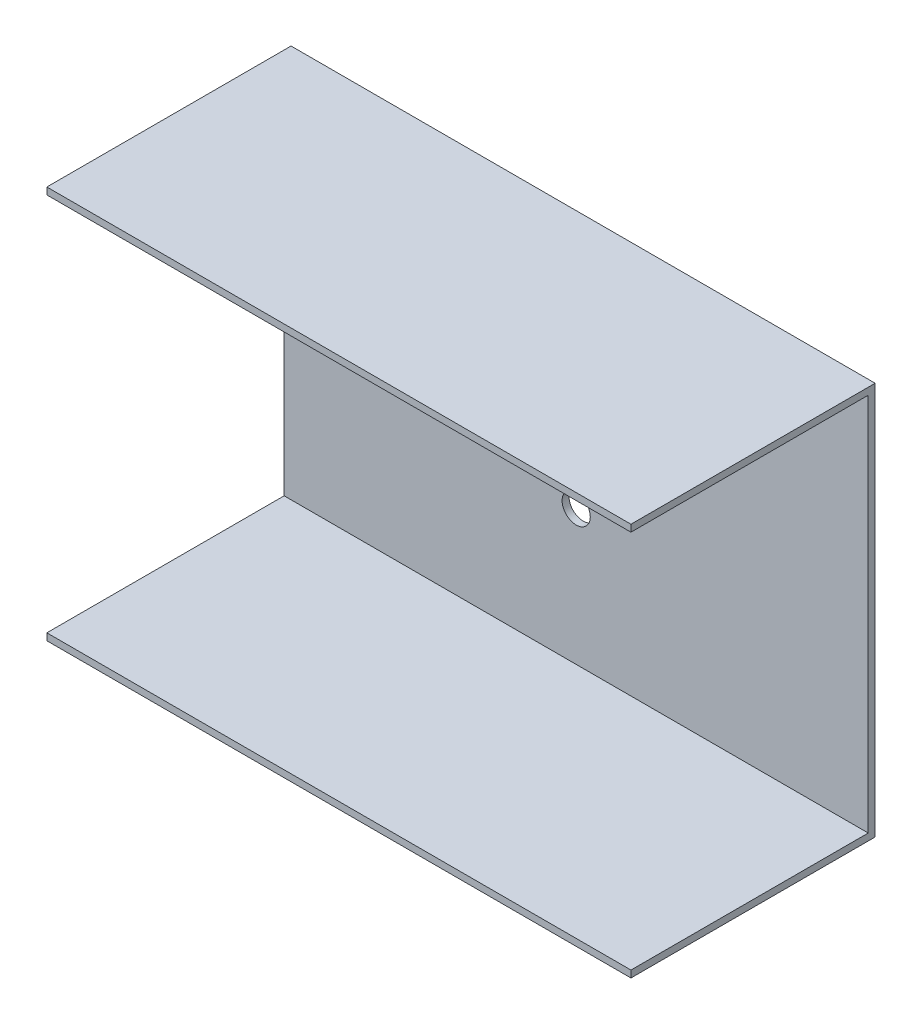
ISO-10303-21;
HEADER;
FILE_DESCRIPTION(('STEP AP214'),'2;1');
FILE_NAME('part.step','',(''),(''),'','','');
FILE_SCHEMA(('AUTOMOTIVE_DESIGN { 1 0 10303 214 1 1 1 1 }'));
ENDSEC;
DATA;
#1=APPLICATION_CONTEXT('core data for automotive mechanical design processes');
#2=APPLICATION_PROTOCOL_DEFINITION('international standard','automotive_design',2000,#1);
#3=PRODUCT_CONTEXT('',#1,'mechanical');
#4=PRODUCT('Part','Part','',(#3));
#5=PRODUCT_RELATED_PRODUCT_CATEGORY('part','',(#4));
#6=PRODUCT_DEFINITION_FORMATION('','',#4);
#7=PRODUCT_DEFINITION_CONTEXT('part definition',#1,'design');
#8=PRODUCT_DEFINITION('design','',#6,#7);
#9=PRODUCT_DEFINITION_SHAPE('','',#8);
#10=(LENGTH_UNIT() NAMED_UNIT(*) SI_UNIT(.MILLI.,.METRE.));
#11=(NAMED_UNIT(*) PLANE_ANGLE_UNIT() SI_UNIT($,.RADIAN.));
#12=(NAMED_UNIT(*) SI_UNIT($,.STERADIAN.) SOLID_ANGLE_UNIT());
#13=UNCERTAINTY_MEASURE_WITH_UNIT(LENGTH_MEASURE(1.E-05),#10,'distance_accuracy_value','');
#14=(GEOMETRIC_REPRESENTATION_CONTEXT(3) GLOBAL_UNCERTAINTY_ASSIGNED_CONTEXT((#13)) GLOBAL_UNIT_ASSIGNED_CONTEXT((#10,
#11,#12)) REPRESENTATION_CONTEXT('',''));
#15=CARTESIAN_POINT('',(0.,0.,0.));
#16=DIRECTION('',(0.,0.,1.));
#17=DIRECTION('',(1.,0.,0.));
#18=AXIS2_PLACEMENT_3D('',#15,#16,#17);
#19=CARTESIAN_POINT('',(135.3879,0.,-56.6002));
#20=DIRECTION('',(0.,-1.,0.));
#21=DIRECTION('',(0.,0.,-1.));
#22=AXIS2_PLACEMENT_3D('',#19,#20,#21);
#23=PLANE('',#22);
#24=DIRECTION('',(0.,0.,1.));
#25=VECTOR('',#24,1.);
#26=CARTESIAN_POINT('',(0.,0.,-56.6002));
#27=LINE('',#26,#25);
#28=CARTESIAN_POINT('',(0.,0.,-56.6002));
#29=VERTEX_POINT('',#28);
#30=CARTESIAN_POINT('',(0.,0.,0.));
#31=VERTEX_POINT('',#30);
#32=EDGE_CURVE('E144',#29,#31,#27,.T.);
#33=ORIENTED_EDGE('',*,*,#32,.T.);
#34=DIRECTION('',(-1.,0.,0.));
#35=VECTOR('',#34,1.);
#36=CARTESIAN_POINT('',(135.3879,0.,0.));
#37=LINE('',#36,#35);
#38=CARTESIAN_POINT('',(135.3879,0.,0.));
#39=VERTEX_POINT('',#38);
#40=EDGE_CURVE('E11',#39,#31,#37,.T.);
#41=ORIENTED_EDGE('',*,*,#40,.F.);
#42=DIRECTION('',(0.,0.,1.));
#43=VECTOR('',#42,1.);
#44=CARTESIAN_POINT('',(135.3879,0.,-56.6002));
#45=LINE('',#44,#43);
#46=CARTESIAN_POINT('',(135.3879,0.,-56.6002));
#47=VERTEX_POINT('',#46);
#48=EDGE_CURVE('E167',#47,#39,#45,.T.);
#49=ORIENTED_EDGE('',*,*,#48,.F.);
#50=DIRECTION('',(-1.,0.,0.));
#51=VECTOR('',#50,1.);
#52=CARTESIAN_POINT('',(135.3879,0.,-56.6002));
#53=LINE('',#52,#51);
#54=EDGE_CURVE('E140',#47,#29,#53,.T.);
#55=ORIENTED_EDGE('',*,*,#54,.T.);
#56=EDGE_LOOP('',(#33,#41,#49,#55));
#57=FACE_BOUND('',#56,.T.);
#58=ADVANCED_FACE('F43',(#57),#23,.F.);
#59=CARTESIAN_POINT('',(135.3879,0.,0.));
#60=DIRECTION('',(0.,0.,-1.));
#61=DIRECTION('',(0.,1.,0.));
#62=AXIS2_PLACEMENT_3D('',#59,#60,#61);
#63=PLANE('',#62);
#64=DIRECTION('',(0.,-1.,0.));
#65=VECTOR('',#64,1.);
#66=CARTESIAN_POINT('',(0.,0.,0.));
#67=LINE('',#66,#65);
#68=CARTESIAN_POINT('',(0.,-1.6002,0.));
#69=VERTEX_POINT('',#68);
#70=EDGE_CURVE('E148',#31,#69,#67,.T.);
#71=ORIENTED_EDGE('',*,*,#70,.T.);
#72=DIRECTION('',(-1.,0.,0.));
#73=VECTOR('',#72,1.);
#74=CARTESIAN_POINT('',(135.3879,-1.6002,0.));
#75=LINE('',#74,#73);
#76=CARTESIAN_POINT('',(135.3879,-1.6002,0.));
#77=VERTEX_POINT('',#76);
#78=EDGE_CURVE('E52',#77,#69,#75,.T.);
#79=ORIENTED_EDGE('',*,*,#78,.F.);
#80=DIRECTION('',(0.,-1.,0.));
#81=VECTOR('',#80,1.);
#82=CARTESIAN_POINT('',(135.3879,0.,0.));
#83=LINE('',#82,#81);
#84=EDGE_CURVE('E103',#39,#77,#83,.T.);
#85=ORIENTED_EDGE('',*,*,#84,.F.);
#86=ORIENTED_EDGE('',*,*,#40,.T.);
#87=EDGE_LOOP('',(#71,#79,#85,#86));
#88=FACE_BOUND('',#87,.T.);
#89=ADVANCED_FACE('F269',(#88),#63,.F.);
#90=CARTESIAN_POINT('',(135.3879,-1.6002,0.));
#91=DIRECTION('',(0.,1.,0.));
#92=DIRECTION('',(0.,0.,1.));
#93=AXIS2_PLACEMENT_3D('',#90,#91,#92);
#94=PLANE('',#93);
#95=DIRECTION('',(0.,0.,-1.));
#96=VECTOR('',#95,1.);
#97=CARTESIAN_POINT('',(0.,-1.6002,0.));
#98=LINE('',#97,#96);
#99=CARTESIAN_POINT('',(0.,-1.6002,-55.));
#100=VERTEX_POINT('',#99);
#101=EDGE_CURVE('E152',#69,#100,#98,.T.);
#102=ORIENTED_EDGE('',*,*,#101,.T.);
#103=DIRECTION('',(-1.,0.,0.));
#104=VECTOR('',#103,1.);
#105=CARTESIAN_POINT('',(135.3879,-1.6002,-55.));
#106=LINE('',#105,#104);
#107=CARTESIAN_POINT('',(135.3879,-1.6002,-55.));
#108=VERTEX_POINT('',#107);
#109=EDGE_CURVE('E178',#108,#100,#106,.T.);
#110=ORIENTED_EDGE('',*,*,#109,.F.);
#111=DIRECTION('',(0.,0.,-1.));
#112=VECTOR('',#111,1.);
#113=CARTESIAN_POINT('',(135.3879,-1.6002,0.));
#114=LINE('',#113,#112);
#115=EDGE_CURVE('E188',#77,#108,#114,.T.);
#116=ORIENTED_EDGE('',*,*,#115,.F.);
#117=ORIENTED_EDGE('',*,*,#78,.T.);
#118=EDGE_LOOP('',(#102,#110,#116,#117));
#119=FACE_BOUND('',#118,.T.);
#120=ADVANCED_FACE('F186',(#119),#94,.F.);
#121=CARTESIAN_POINT('',(135.3879,-1.6002,-55.));
#122=DIRECTION('',(0.,0.,-1.));
#123=DIRECTION('',(0.,1.,0.));
#124=AXIS2_PLACEMENT_3D('',#121,#122,#123);
#125=PLANE('',#124);
#126=CARTESIAN_POINT('',(67.69395,-32.84554,-55.));
#127=DIRECTION('',(0.,0.,1.));
#128=DIRECTION('',(1.,0.,0.));
#129=AXIS2_PLACEMENT_3D('',#126,#127,#128);
#130=CIRCLE('',#129,3.2639);
#131=CARTESIAN_POINT('',(70.95785,-32.84554,-55.));
#132=VERTEX_POINT('',#131);
#133=EDGE_CURVE('E232',#132,#132,#130,.T.);
#134=ORIENTED_EDGE('',*,*,#133,.F.);
#135=EDGE_LOOP('',(#134));
#136=FACE_BOUND('',#135,.T.);
#137=CARTESIAN_POINT('',(67.69395,-58.24554,-55.));
#138=DIRECTION('',(0.,0.,1.));
#139=DIRECTION('',(1.,0.,0.));
#140=AXIS2_PLACEMENT_3D('',#137,#138,#139);
#141=CIRCLE('',#140,3.2639);
#142=CARTESIAN_POINT('',(70.95785,-58.24554,-55.));
#143=VERTEX_POINT('',#142);
#144=EDGE_CURVE('E228',#143,#143,#141,.T.);
#145=ORIENTED_EDGE('',*,*,#144,.F.);
#146=EDGE_LOOP('',(#145));
#147=FACE_BOUND('',#146,.T.);
#148=CARTESIAN_POINT('',(54.99395,-45.54554,-55.));
#149=DIRECTION('',(0.,0.,1.));
#150=DIRECTION('',(1.,0.,0.));
#151=AXIS2_PLACEMENT_3D('',#148,#149,#150);
#152=CIRCLE('',#151,3.26390000000001);
#153=CARTESIAN_POINT('',(58.25785,-45.54554,-55.));
#154=VERTEX_POINT('',#153);
#155=EDGE_CURVE('E220',#154,#154,#152,.T.);
#156=ORIENTED_EDGE('',*,*,#155,.F.);
#157=EDGE_LOOP('',(#156));
#158=FACE_BOUND('',#157,.T.);
#159=CARTESIAN_POINT('',(80.39395,-45.54554,-55.));
#160=DIRECTION('',(0.,0.,1.));
#161=DIRECTION('',(1.,0.,0.));
#162=AXIS2_PLACEMENT_3D('',#159,#160,#161);
#163=CIRCLE('',#162,3.2639);
#164=CARTESIAN_POINT('',(83.65785,-45.54554,-55.));
#165=VERTEX_POINT('',#164);
#166=EDGE_CURVE('E211',#165,#165,#163,.T.);
#167=ORIENTED_EDGE('',*,*,#166,.F.);
#168=EDGE_LOOP('',(#167));
#169=FACE_BOUND('',#168,.T.);
#170=DIRECTION('',(0.,-1.,0.));
#171=VECTOR('',#170,1.);
#172=CARTESIAN_POINT('',(0.,-1.6002,-55.));
#173=LINE('',#172,#171);
#174=CARTESIAN_POINT('',(0.,-89.49088,-55.));
#175=VERTEX_POINT('',#174);
#176=EDGE_CURVE('E155',#100,#175,#173,.T.);
#177=ORIENTED_EDGE('',*,*,#176,.T.);
#178=DIRECTION('',(-1.,0.,0.));
#179=VECTOR('',#178,1.);
#180=CARTESIAN_POINT('',(135.3879,-89.49088,-55.));
#181=LINE('',#180,#179);
#182=CARTESIAN_POINT('',(135.3879,-89.49088,-55.));
#183=VERTEX_POINT('',#182);
#184=EDGE_CURVE('E174',#183,#175,#181,.T.);
#185=ORIENTED_EDGE('',*,*,#184,.F.);
#186=DIRECTION('',(0.,-1.,0.));
#187=VECTOR('',#186,1.);
#188=CARTESIAN_POINT('',(135.3879,-1.6002,-55.));
#189=LINE('',#188,#187);
#190=EDGE_CURVE('E201',#108,#183,#189,.T.);
#191=ORIENTED_EDGE('',*,*,#190,.F.);
#192=ORIENTED_EDGE('',*,*,#109,.T.);
#193=EDGE_LOOP('',(#177,#185,#191,#192));
#194=FACE_BOUND('',#193,.T.);
#195=ADVANCED_FACE('F196',(#136,#147,#158,#169,#194),#125,.F.);
#196=CARTESIAN_POINT('',(135.3879,-89.49088,-55.));
#197=DIRECTION('',(0.,-1.,0.));
#198=DIRECTION('',(0.,0.,-1.));
#199=AXIS2_PLACEMENT_3D('',#196,#197,#198);
#200=PLANE('',#199);
#201=DIRECTION('',(0.,0.,1.));
#202=VECTOR('',#201,1.);
#203=CARTESIAN_POINT('',(0.,-89.49088,-55.));
#204=LINE('',#203,#202);
#205=CARTESIAN_POINT('',(0.,-89.49088,0.));
#206=VERTEX_POINT('',#205);
#207=EDGE_CURVE('E158',#175,#206,#204,.T.);
#208=ORIENTED_EDGE('',*,*,#207,.T.);
#209=DIRECTION('',(-1.,0.,0.));
#210=VECTOR('',#209,1.);
#211=CARTESIAN_POINT('',(135.3879,-89.49088,0.));
#212=LINE('',#211,#210);
#213=CARTESIAN_POINT('',(135.3879,-89.49088,0.));
#214=VERTEX_POINT('',#213);
#215=EDGE_CURVE('E133',#214,#206,#212,.T.);
#216=ORIENTED_EDGE('',*,*,#215,.F.);
#217=DIRECTION('',(0.,0.,1.));
#218=VECTOR('',#217,1.);
#219=CARTESIAN_POINT('',(135.3879,-89.49088,-55.));
#220=LINE('',#219,#218);
#221=EDGE_CURVE('E122',#183,#214,#220,.T.);
#222=ORIENTED_EDGE('',*,*,#221,.F.);
#223=ORIENTED_EDGE('',*,*,#184,.T.);
#224=EDGE_LOOP('',(#208,#216,#222,#223));
#225=FACE_BOUND('',#224,.T.);
#226=ADVANCED_FACE('F199',(#225),#200,.F.);
#227=CARTESIAN_POINT('',(135.3879,-89.49088,0.));
#228=DIRECTION('',(0.,0.,-1.));
#229=DIRECTION('',(0.,1.,0.));
#230=AXIS2_PLACEMENT_3D('',#227,#228,#229);
#231=PLANE('',#230);
#232=DIRECTION('',(0.,-1.,0.));
#233=VECTOR('',#232,1.);
#234=CARTESIAN_POINT('',(0.,-89.49088,0.));
#235=LINE('',#234,#233);
#236=CARTESIAN_POINT('',(0.,-91.09108,0.));
#237=VERTEX_POINT('',#236);
#238=EDGE_CURVE('E131',#206,#237,#235,.T.);
#239=ORIENTED_EDGE('',*,*,#238,.T.);
#240=DIRECTION('',(-1.,0.,0.));
#241=VECTOR('',#240,1.);
#242=CARTESIAN_POINT('',(135.3879,-91.09108,0.));
#243=LINE('',#242,#241);
#244=CARTESIAN_POINT('',(135.3879,-91.09108,0.));
#245=VERTEX_POINT('',#244);
#246=EDGE_CURVE('E128',#245,#237,#243,.T.);
#247=ORIENTED_EDGE('',*,*,#246,.F.);
#248=DIRECTION('',(0.,-1.,0.));
#249=VECTOR('',#248,1.);
#250=CARTESIAN_POINT('',(135.3879,-89.49088,0.));
#251=LINE('',#250,#249);
#252=EDGE_CURVE('E116',#214,#245,#251,.T.);
#253=ORIENTED_EDGE('',*,*,#252,.F.);
#254=ORIENTED_EDGE('',*,*,#215,.T.);
#255=EDGE_LOOP('',(#239,#247,#253,#254));
#256=FACE_BOUND('',#255,.T.);
#257=ADVANCED_FACE('F129',(#256),#231,.F.);
#258=CARTESIAN_POINT('',(135.3879,-91.09108,0.));
#259=DIRECTION('',(0.,1.,0.));
#260=DIRECTION('',(0.,0.,1.));
#261=AXIS2_PLACEMENT_3D('',#258,#259,#260);
#262=PLANE('',#261);
#263=DIRECTION('',(0.,0.,-1.));
#264=VECTOR('',#263,1.);
#265=CARTESIAN_POINT('',(0.,-91.09108,0.));
#266=LINE('',#265,#264);
#267=CARTESIAN_POINT('',(0.,-91.09108,-56.6002));
#268=VERTEX_POINT('',#267);
#269=EDGE_CURVE('E89',#237,#268,#266,.T.);
#270=ORIENTED_EDGE('',*,*,#269,.T.);
#271=DIRECTION('',(-1.,0.,0.));
#272=VECTOR('',#271,1.);
#273=CARTESIAN_POINT('',(135.3879,-91.09108,-56.6002));
#274=LINE('',#273,#272);
#275=CARTESIAN_POINT('',(135.3879,-91.09108,-56.6002));
#276=VERTEX_POINT('',#275);
#277=EDGE_CURVE('E134',#276,#268,#274,.T.);
#278=ORIENTED_EDGE('',*,*,#277,.F.);
#279=DIRECTION('',(0.,0.,-1.));
#280=VECTOR('',#279,1.);
#281=CARTESIAN_POINT('',(135.3879,-91.09108,0.));
#282=LINE('',#281,#280);
#283=EDGE_CURVE('E120',#245,#276,#282,.T.);
#284=ORIENTED_EDGE('',*,*,#283,.F.);
#285=ORIENTED_EDGE('',*,*,#246,.T.);
#286=EDGE_LOOP('',(#270,#278,#284,#285));
#287=FACE_BOUND('',#286,.T.);
#288=ADVANCED_FACE('F136',(#287),#262,.F.);
#289=CARTESIAN_POINT('',(135.3879,-91.09108,-56.6002));
#290=DIRECTION('',(0.,0.,1.));
#291=DIRECTION('',(1.,0.,0.));
#292=AXIS2_PLACEMENT_3D('',#289,#290,#291);
#293=PLANE('',#292);
#294=CARTESIAN_POINT('',(67.69395,-32.84554,-56.6002));
#295=DIRECTION('',(0.,0.,1.));
#296=DIRECTION('',(1.,0.,0.));
#297=AXIS2_PLACEMENT_3D('',#294,#295,#296);
#298=CIRCLE('',#297,3.2639);
#299=CARTESIAN_POINT('',(70.95785,-32.84554,-56.6002));
#300=VERTEX_POINT('',#299);
#301=EDGE_CURVE('E149',#300,#300,#298,.F.);
#302=ORIENTED_EDGE('',*,*,#301,.F.);
#303=EDGE_LOOP('',(#302));
#304=FACE_BOUND('',#303,.T.);
#305=CARTESIAN_POINT('',(67.69395,-58.24554,-56.6002));
#306=DIRECTION('',(0.,0.,1.));
#307=DIRECTION('',(1.,0.,0.));
#308=AXIS2_PLACEMENT_3D('',#305,#306,#307);
#309=CIRCLE('',#308,3.2639);
#310=CARTESIAN_POINT('',(70.95785,-58.24554,-56.6002));
#311=VERTEX_POINT('',#310);
#312=EDGE_CURVE('E224',#311,#311,#309,.F.);
#313=ORIENTED_EDGE('',*,*,#312,.F.);
#314=EDGE_LOOP('',(#313));
#315=FACE_BOUND('',#314,.T.);
#316=CARTESIAN_POINT('',(54.99395,-45.54554,-56.6002));
#317=DIRECTION('',(0.,0.,1.));
#318=DIRECTION('',(1.,0.,0.));
#319=AXIS2_PLACEMENT_3D('',#316,#317,#318);
#320=CIRCLE('',#319,3.26390000000001);
#321=CARTESIAN_POINT('',(58.25785,-45.54554,-56.6002));
#322=VERTEX_POINT('',#321);
#323=EDGE_CURVE('E215',#322,#322,#320,.F.);
#324=ORIENTED_EDGE('',*,*,#323,.F.);
#325=EDGE_LOOP('',(#324));
#326=FACE_BOUND('',#325,.T.);
#327=CARTESIAN_POINT('',(80.39395,-45.54554,-56.6002));
#328=DIRECTION('',(0.,0.,1.));
#329=DIRECTION('',(1.,0.,0.));
#330=AXIS2_PLACEMENT_3D('',#327,#328,#329);
#331=CIRCLE('',#330,3.2639);
#332=CARTESIAN_POINT('',(83.65785,-45.54554,-56.6002));
#333=VERTEX_POINT('',#332);
#334=EDGE_CURVE('E216',#333,#333,#331,.F.);
#335=ORIENTED_EDGE('',*,*,#334,.F.);
#336=EDGE_LOOP('',(#335));
#337=FACE_BOUND('',#336,.T.);
#338=DIRECTION('',(0.,1.,0.));
#339=VECTOR('',#338,1.);
#340=CARTESIAN_POINT('',(0.,-91.09108,-56.6002));
#341=LINE('',#340,#339);
#342=EDGE_CURVE('E95',#268,#29,#341,.T.);
#343=ORIENTED_EDGE('',*,*,#342,.T.);
#344=ORIENTED_EDGE('',*,*,#54,.F.);
#345=DIRECTION('',(0.,1.,0.));
#346=VECTOR('',#345,1.);
#347=CARTESIAN_POINT('',(135.3879,-91.09108,-56.6002));
#348=LINE('',#347,#346);
#349=EDGE_CURVE('E60',#276,#47,#348,.T.);
#350=ORIENTED_EDGE('',*,*,#349,.F.);
#351=ORIENTED_EDGE('',*,*,#277,.T.);
#352=EDGE_LOOP('',(#343,#344,#350,#351));
#353=FACE_BOUND('',#352,.T.);
#354=ADVANCED_FACE('F276',(#304,#315,#326,#337,#353),#293,.F.);
#355=CARTESIAN_POINT('',(135.3879,0.,0.));
#356=DIRECTION('',(1.,0.,0.));
#357=DIRECTION('',(0.,0.,-1.));
#358=AXIS2_PLACEMENT_3D('',#355,#356,#357);
#359=PLANE('',#358);
#360=ORIENTED_EDGE('',*,*,#48,.T.);
#361=ORIENTED_EDGE('',*,*,#84,.T.);
#362=ORIENTED_EDGE('',*,*,#115,.T.);
#363=ORIENTED_EDGE('',*,*,#190,.T.);
#364=ORIENTED_EDGE('',*,*,#221,.T.);
#365=ORIENTED_EDGE('',*,*,#252,.T.);
#366=ORIENTED_EDGE('',*,*,#283,.T.);
#367=ORIENTED_EDGE('',*,*,#349,.T.);
#368=EDGE_LOOP('',(#360,#361,#362,#363,#364,#365,#366,#367));
#369=FACE_BOUND('',#368,.T.);
#370=ADVANCED_FACE('F118',(#369),#359,.T.);
#371=CARTESIAN_POINT('',(0.,0.,0.));
#372=DIRECTION('',(1.,0.,0.));
#373=DIRECTION('',(0.,0.,-1.));
#374=AXIS2_PLACEMENT_3D('',#371,#372,#373);
#375=PLANE('',#374);
#376=ORIENTED_EDGE('',*,*,#32,.F.);
#377=ORIENTED_EDGE('',*,*,#342,.F.);
#378=ORIENTED_EDGE('',*,*,#269,.F.);
#379=ORIENTED_EDGE('',*,*,#238,.F.);
#380=ORIENTED_EDGE('',*,*,#207,.F.);
#381=ORIENTED_EDGE('',*,*,#176,.F.);
#382=ORIENTED_EDGE('',*,*,#101,.F.);
#383=ORIENTED_EDGE('',*,*,#70,.F.);
#384=EDGE_LOOP('',(#376,#377,#378,#379,#380,#381,#382,#383));
#385=FACE_BOUND('',#384,.T.);
#386=ADVANCED_FACE('F192',(#385),#375,.F.);
#387=CARTESIAN_POINT('',(80.39395,-45.54554,-65.8319032924591));
#388=DIRECTION('',(0.,0.,1.));
#389=DIRECTION('',(1.,0.,0.));
#390=AXIS2_PLACEMENT_3D('',#387,#388,#389);
#391=CYLINDRICAL_SURFACE('',#390,3.2639);
#392=ORIENTED_EDGE('',*,*,#334,.T.);
#393=EDGE_LOOP('',(#392));
#394=FACE_BOUND('',#393,.T.);
#395=ORIENTED_EDGE('',*,*,#166,.T.);
#396=EDGE_LOOP('',(#395));
#397=FACE_BOUND('',#396,.T.);
#398=ADVANCED_FACE('F254',(#394,#397),#391,.F.);
#399=CARTESIAN_POINT('',(54.99395,-45.54554,-65.8319032924591));
#400=DIRECTION('',(0.,0.,1.));
#401=DIRECTION('',(1.,0.,0.));
#402=AXIS2_PLACEMENT_3D('',#399,#400,#401);
#403=CYLINDRICAL_SURFACE('',#402,3.26390000000001);
#404=ORIENTED_EDGE('',*,*,#323,.T.);
#405=EDGE_LOOP('',(#404));
#406=FACE_BOUND('',#405,.T.);
#407=ORIENTED_EDGE('',*,*,#155,.T.);
#408=EDGE_LOOP('',(#407));
#409=FACE_BOUND('',#408,.T.);
#410=ADVANCED_FACE('F256',(#406,#409),#403,.F.);
#411=CARTESIAN_POINT('',(67.69395,-58.24554,-65.8319032924591));
#412=DIRECTION('',(0.,0.,1.));
#413=DIRECTION('',(1.,0.,0.));
#414=AXIS2_PLACEMENT_3D('',#411,#412,#413);
#415=CYLINDRICAL_SURFACE('',#414,3.2639);
#416=ORIENTED_EDGE('',*,*,#312,.T.);
#417=EDGE_LOOP('',(#416));
#418=FACE_BOUND('',#417,.T.);
#419=ORIENTED_EDGE('',*,*,#144,.T.);
#420=EDGE_LOOP('',(#419));
#421=FACE_BOUND('',#420,.T.);
#422=ADVANCED_FACE('F263',(#418,#421),#415,.F.);
#423=CARTESIAN_POINT('',(67.69395,-32.84554,-65.8319032924591));
#424=DIRECTION('',(0.,0.,1.));
#425=DIRECTION('',(1.,0.,0.));
#426=AXIS2_PLACEMENT_3D('',#423,#424,#425);
#427=CYLINDRICAL_SURFACE('',#426,3.2639);
#428=ORIENTED_EDGE('',*,*,#301,.T.);
#429=EDGE_LOOP('',(#428));
#430=FACE_BOUND('',#429,.T.);
#431=ORIENTED_EDGE('',*,*,#133,.T.);
#432=EDGE_LOOP('',(#431));
#433=FACE_BOUND('',#432,.T.);
#434=ADVANCED_FACE('F243',(#430,#433),#427,.F.);
#435=CLOSED_SHELL('',(#58,#89,#120,#195,#226,#257,#288,#354,#370,#386,#398,#410,#422,#434));
#436=MANIFOLD_SOLID_BREP('B2',#435);
#437=ADVANCED_BREP_SHAPE_REPRESENTATION('',(#18,#436),#14);
#438=SHAPE_DEFINITION_REPRESENTATION(#9,#437);
ENDSEC;
END-ISO-10303-21;
